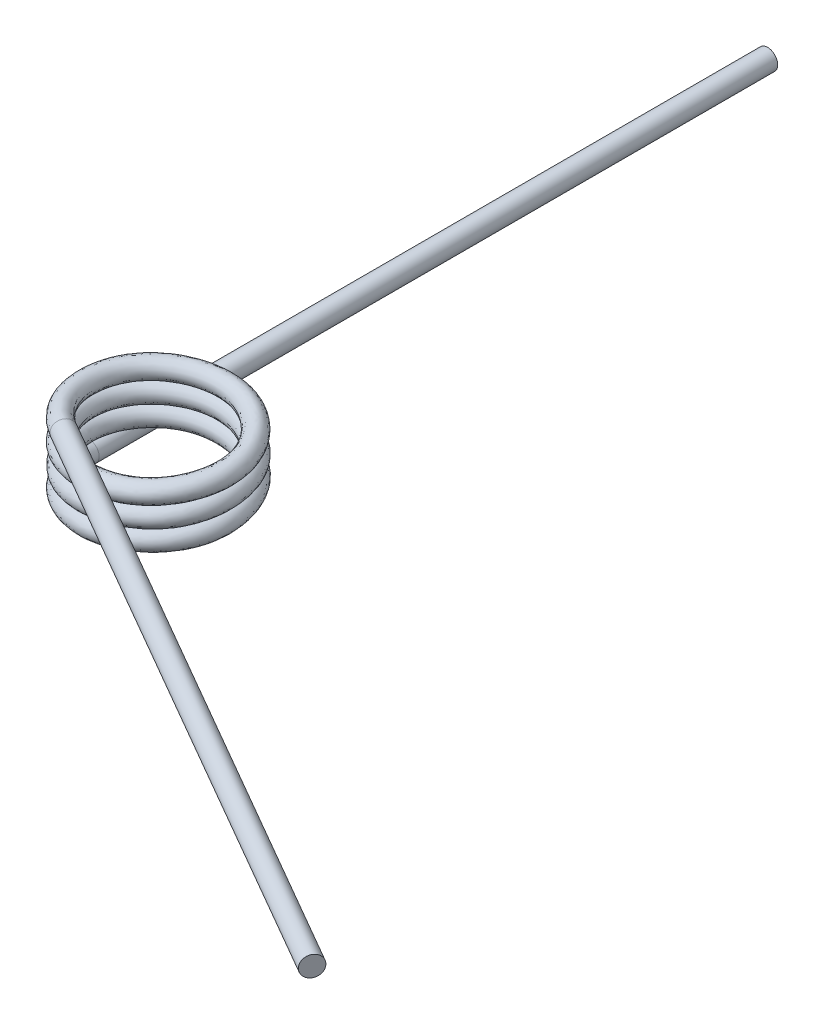
ISO-10303-21;
HEADER;
FILE_DESCRIPTION(('STEP AP214'),'2;1');
FILE_NAME('part.step','',(''),(''),'','','');
FILE_SCHEMA(('AUTOMOTIVE_DESIGN { 1 0 10303 214 1 1 1 1 }'));
ENDSEC;
DATA;
#1=APPLICATION_CONTEXT('core data for automotive mechanical design processes');
#2=APPLICATION_PROTOCOL_DEFINITION('international standard','automotive_design',2000,#1);
#3=PRODUCT_CONTEXT('',#1,'mechanical');
#4=PRODUCT('Part','Part','',(#3));
#5=PRODUCT_RELATED_PRODUCT_CATEGORY('part','',(#4));
#6=PRODUCT_DEFINITION_FORMATION('','',#4);
#7=PRODUCT_DEFINITION_CONTEXT('part definition',#1,'design');
#8=PRODUCT_DEFINITION('design','',#6,#7);
#9=PRODUCT_DEFINITION_SHAPE('','',#8);
#10=(LENGTH_UNIT() NAMED_UNIT(*) SI_UNIT(.MILLI.,.METRE.));
#11=(NAMED_UNIT(*) PLANE_ANGLE_UNIT() SI_UNIT($,.RADIAN.));
#12=(NAMED_UNIT(*) SI_UNIT($,.STERADIAN.) SOLID_ANGLE_UNIT());
#13=UNCERTAINTY_MEASURE_WITH_UNIT(LENGTH_MEASURE(1.E-05),#10,'distance_accuracy_value','');
#14=(GEOMETRIC_REPRESENTATION_CONTEXT(3) GLOBAL_UNCERTAINTY_ASSIGNED_CONTEXT((#13)) GLOBAL_UNIT_ASSIGNED_CONTEXT((#10,
#11,#12)) REPRESENTATION_CONTEXT('',''));
#15=CARTESIAN_POINT('',(0.,0.,0.));
#16=DIRECTION('',(0.,0.,1.));
#17=DIRECTION('',(1.,0.,0.));
#18=AXIS2_PLACEMENT_3D('',#15,#16,#17);
#19=CARTESIAN_POINT('',(40.751270189222,4.75,29.4167295593006));
#20=DIRECTION('',(-0.86602540378444,0.,-0.499999999999998));
#21=DIRECTION('',(0.499999999999998,0.,-0.86602540378444));
#22=AXIS2_PLACEMENT_3D('',#19,#20,#21);
#23=PLANE('',#22);
#24=CARTESIAN_POINT('',(40.751270189222,4.75,29.4167295593006));
#25=DIRECTION('',(0.86602540378444,0.,0.499999999999998));
#26=DIRECTION('',(0.499999999999998,0.,-0.86602540378444));
#27=AXIS2_PLACEMENT_3D('',#24,#25,#26);
#28=CIRCLE('',#27,0.745000000000001);
#29=CARTESIAN_POINT('',(41.123770189222,4.75,28.7715406334811));
#30=VERTEX_POINT('',#29);
#31=EDGE_CURVE('E52',#30,#30,#28,.T.);
#32=ORIENTED_EDGE('',*,*,#31,.T.);
#33=EDGE_LOOP('',(#32));
#34=FACE_BOUND('',#33,.T.);
#35=ADVANCED_FACE('F37',(#34),#23,.F.);
#36=CARTESIAN_POINT('',(-5.1,0.,-50.0000000000001));
#37=DIRECTION('',(0.,0.,-1.));
#38=DIRECTION('',(0.999999993495773,0.000114054609235299,0.));
#39=AXIS2_PLACEMENT_3D('',#36,#37,#38);
#40=PLANE('',#39);
#41=CARTESIAN_POINT('',(-5.1,0.,-50.0000000000001));
#42=DIRECTION('',(0.,0.,1.));
#43=DIRECTION('',(0.999999993495773,0.000114054609235299,0.));
#44=AXIS2_PLACEMENT_3D('',#41,#42,#43);
#45=CIRCLE('',#44,0.745000000000001);
#46=CARTESIAN_POINT('',(-4.35500000484565,8.49706838828999E-05,-50.0000000000001));
#47=VERTEX_POINT('',#46);
#48=EDGE_CURVE('E46',#47,#47,#45,.T.);
#49=ORIENTED_EDGE('',*,*,#48,.F.);
#50=EDGE_LOOP('',(#49));
#51=FACE_BOUND('',#50,.T.);
#52=ADVANCED_FACE('F121',(#51),#40,.T.);
#53=CARTESIAN_POINT('',(-2.54999999999986,4.75,4.41672955930072));
#54=DIRECTION('',(0.86602540378444,0.,0.499999999999998));
#55=DIRECTION('',(-0.499999999999998,0.,0.86602540378444));
#56=AXIS2_PLACEMENT_3D('',#53,#54,#55);
#57=CYLINDRICAL_SURFACE('',#56,0.745000000000001);
#58=ORIENTED_EDGE('',*,*,#31,.F.);
#59=EDGE_LOOP('',(#58));
#60=FACE_BOUND('',#59,.T.);
#61=CARTESIAN_POINT('',(-2.54999999999986,4.75,4.41672955930072));
#62=DIRECTION('',(0.865078141904125,0.0467590761205418,0.49945309809837));
#63=DIRECTION('',(0.499999999999971,0.,-0.866025403784455));
#64=AXIS2_PLACEMENT_3D('',#61,#62,#63);
#65=CIRCLE('',#64,0.745000000000001);
#66=CARTESIAN_POINT('',(-2.17749999999988,4.75,3.77154063348131));
#67=VERTEX_POINT('',#66);
#68=EDGE_CURVE('E40',#67,#67,#65,.T.);
#69=ORIENTED_EDGE('',*,*,#68,.T.);
#70=EDGE_LOOP('',(#69));
#71=FACE_BOUND('',#70,.T.);
#72=ADVANCED_FACE('F87',(#60,#71),#57,.T.);
#73=CARTESIAN_POINT('',(-4.35500000484565,8.487774262253E-05,-3.97315072508952E-06));
#74=CARTESIAN_POINT('',(-4.35500049170764,0.0318251134394401,0.580614354438627));
#75=CARTESIAN_POINT('',(-4.2364972186672,0.0637293674077387,1.15898934681182));
#76=CARTESIAN_POINT('',(-3.34382063298787,0.189542885596853,3.28676576476936));
#77=CARTESIAN_POINT('',(-1.64198350085726,0.285312357410858,4.39030935080475));
#78=CARTESIAN_POINT('',(1.82038378486212,0.474574749287439,4.31786427379777));
#79=CARTESIAN_POINT('',(3.47975661831278,0.570680960794775,3.13679904669445));
#80=CARTESIAN_POINT('',(4.68394249037422,0.759399147764391,-0.100663864271291));
#81=CARTESIAN_POINT('',(4.19578314369764,0.855808187502534,-2.08224169545151));
#82=CARTESIAN_POINT('',(1.63240436819268,1.04427251357315,-4.39049577210397));
#83=CARTESIAN_POINT('',(-0.39309143740907,1.14090778587528,-4.66687505816701));
#84=CARTESIAN_POINT('',(-3.28620030908023,1.31737576799749,-3.23081301513331));
#85=CARTESIAN_POINT('',(-4.24568962950313,1.40117141018875,-1.79832159252394));
#86=CARTESIAN_POINT('',(-4.46414136401961,1.58364356683938,1.51850371389823));
#87=CARTESIAN_POINT('',(-3.33398435376845,1.6823165192278,3.33163819513206));
#88=CARTESIAN_POINT('',(0.00172474382794839,1.88037268477115,4.71531052251248));
#89=CARTESIAN_POINT('',(2.08468449365833,1.97945582915486,4.22659895090588));
#90=CARTESIAN_POINT('',(4.46420956669407,2.17696977865208,1.51568252557284));
#91=CARTESIAN_POINT('',(4.67193967777459,2.27665500806623,-0.617961506523748));
#92=CARTESIAN_POINT('',(2.90720385488669,2.46948952572873,-3.67457675765263));
#93=CARTESIAN_POINT('',(1.07004084215955,2.56581083547791,-4.56023571167163));
#94=CARTESIAN_POINT('',(-2.34230030935838,2.75426742698828,-4.05634457903697));
#95=CARTESIAN_POINT('',(-3.8465986247731,2.85093068165208,-2.67149936492073));
#96=CARTESIAN_POINT('',(-4.63326245470203,3.03915174132399,0.682515674605258));
#97=CARTESIAN_POINT('',(-3.89952833681419,3.13595758715663,2.59332510243099));
#98=CARTESIAN_POINT('',(-1.07137739662917,3.32412813591685,4.55889107357602));
#99=CARTESIAN_POINT('',(0.974999867530022,3.42091086631926,4.5808468289116));
#100=CARTESIAN_POINT('',(3.84508417751786,3.60917709184034,2.6738681772122));
#101=CARTESIAN_POINT('',(4.61848238140257,3.70581236414485,0.781548440301908));
#102=CARTESIAN_POINT('',(3.90116810590134,3.8942766902123,-2.59253037609788));
#103=CARTESIAN_POINT('',(2.42915237049425,3.99068572995283,-4.00607907497452));
#104=CARTESIAN_POINT('',(-0.976665177286501,4.17940391692034,-4.5819580079773));
#105=CARTESIAN_POINT('',(-2.82918487864418,4.27551012841045,-3.73543333767719));
#106=CARTESIAN_POINT('',(-4.62311044298602,4.46477252033694,-0.773159450931185));
#107=CARTESIAN_POINT('',(-4.51833416186233,4.56054199214691,1.25244664889552));
#108=CARTESIAN_POINT('',(-3.12196563467448,4.68635551025706,3.08941668344599));
#109=CARTESIAN_POINT('',(-2.68033020664833,4.71825976418418,3.48123144049209));
#110=CARTESIAN_POINT('',(-2.17749999999988,4.75,3.77154063348131));
#111=CARTESIAN_POINT('',(-4.3550444953917,0.389739290851539,-0.0182438043106817));
#112=CARTESIAN_POINT('',(-4.35743067730607,0.42147901766897,0.562370637805144));
#113=CARTESIAN_POINT('',(-4.24143373838931,0.453383421193437,1.14127095934273));
#114=CARTESIAN_POINT('',(-3.35732175797539,0.57919731863556,3.2726535447019));
#115=CARTESIAN_POINT('',(-1.66037831683773,0.6749667534224,4.38361648445679));
#116=CARTESIAN_POINT('',(1.80230383103092,0.864228999829954,4.32536030468612));
#117=CARTESIAN_POINT('',(3.46679615785935,0.960335234594922,3.15145140882974));
#118=CARTESIAN_POINT('',(4.68422639277815,1.14905345994255,-0.0811043425474707));
#119=CARTESIAN_POINT('',(4.20464174518433,1.24546246580036,-2.06480433178066));
#120=CARTESIAN_POINT('',(1.65068884393576,1.43392682339603,-4.38355285397389));
#121=CARTESIAN_POINT('',(-0.373620759638226,1.53056206393851,-4.668699178064));
#122=CARTESIAN_POINT('',(-3.27261714850838,1.70703007601714,-3.24446049595396));
#123=CARTESIAN_POINT('',(-4.23812742949449,1.79082613925565,-1.81611002308571));
#124=CARTESIAN_POINT('',(-4.47060846940009,1.97329766548903,1.49980823636565));
#125=CARTESIAN_POINT('',(-3.34795401277138,2.07197143910668,3.3176853404266));
#126=CARTESIAN_POINT('',(-0.0180403796259266,2.27002653825817,4.71537739474776));
#127=CARTESIAN_POINT('',(2.06704907975817,2.36911060368498,4.23540387821955));
#128=CARTESIAN_POINT('',(4.45784688676837,2.56662365281875,1.53435744288643));
#129=CARTESIAN_POINT('',(4.67470740055399,2.66630928507945,-0.598484136218733));
#130=CARTESIAN_POINT('',(2.92246185338006,2.85914383611992,-3.66233179746611));
#131=CARTESIAN_POINT('',(1.08912348397193,2.95546511320404,-4.55594663461274));
#132=CARTESIAN_POINT('',(-2.32529594414166,3.14392173734746,-4.06600699417008));
#133=CARTESIAN_POINT('',(-3.83559468256181,3.24058495935131,-2.6876651041417));
#134=CARTESIAN_POINT('',(-4.63597819024973,3.42880605171079,0.663150434844749));
#135=CARTESIAN_POINT('',(-3.91050923385793,3.52561186475564,2.57714451171854));
#136=CARTESIAN_POINT('',(-1.09038141670151,3.71378244640444,4.55428586188423));
#137=CARTESIAN_POINT('',(0.955911186183937,3.81056514375629,4.58509727078419));
#138=CARTESIAN_POINT('',(3.83380861712062,3.99883140249007,2.68984538124462));
#139=CARTESIAN_POINT('',(4.61540012711368,4.09546664134996,0.800862976099099));
#140=CARTESIAN_POINT('',(3.91187980144262,4.28393100113013,-2.57616667756522));
#141=CARTESIAN_POINT('',(2.4459745527016,4.38034000938931,-3.99609432698256));
#142=CARTESIAN_POINT('',(-0.957505881448252,4.56905822341989,-4.58590277047893));
#143=CARTESIAN_POINT('',(-2.81368190913212,4.66516434884079,-3.74738141756176));
#144=CARTESIAN_POINT('',(-4.61975659764122,4.85442694762752,-0.792443928112072));
#145=CARTESIAN_POINT('',(-4.52385147960471,4.95019637584698,1.23371077991619));
#146=CARTESIAN_POINT('',(-3.13487375476307,5.07600957814911,3.07631401487017));
#147=CARTESIAN_POINT('',(-2.69494216833974,5.10791365766652,3.4700404570818));
#148=CARTESIAN_POINT('',(-2.19329615724789,5.13965441564331,3.76242071784201));
#149=CARTESIAN_POINT('',(-4.71000388540033,0.744229553208378,-0.0348375918201096));
#150=CARTESIAN_POINT('',(-4.71455967713096,0.77607512328392,0.594473174599712));
#151=CARTESIAN_POINT('',(-4.59163304717953,0.807781040852221,1.21853993434331));
#152=CARTESIAN_POINT('',(-3.64119863484889,0.934101416257114,3.52986305417836));
#153=CARTESIAN_POINT('',(-1.81309820878181,1.02922768950157,4.73536929162816));
#154=CARTESIAN_POINT('',(1.93640113695547,1.21897955229377,4.68402671420631));
#155=CARTESIAN_POINT('',(3.73781945984736,1.31458472797592,3.42250394914565));
#156=CARTESIAN_POINT('',(5.06698587987493,1.50382504584466,-0.0735951352792703));
#157=CARTESIAN_POINT('',(4.5562930567729,1.59971260049663,-2.21715158775408));
#158=CARTESIAN_POINT('',(1.7987114423202,1.78869741487151,-4.73653229136875));
#159=CARTESIAN_POINT('',(-0.385957075424886,1.88481246259124,-5.05167982705533));
#160=CARTESIAN_POINT('',(-3.52981044259893,2.06176782940682,-3.51931634967948));
#161=CARTESIAN_POINT('',(-4.57732636628947,2.14541557266747,-1.97819271011646));
#162=CARTESIAN_POINT('',(-4.84025928792202,2.32768000475795,1.60547371382181));
#163=CARTESIAN_POINT('',(-3.63231693014202,2.42649103323058,3.57655020059567));
#164=CARTESIAN_POINT('',(-0.0363415266428418,2.62447815546436,5.09954733877955));
#165=CARTESIAN_POINT('',(2.22024333216708,2.7235041443518,4.58862591389111));
#166=CARTESIAN_POINT('',(4.81629870353897,2.92120768729321,1.67439859418513));
#167=CARTESIAN_POINT('',(5.05913211866886,3.02054793186292,-0.6291196301077));
#168=CARTESIAN_POINT('',(3.17215984484991,3.21391505086447,-3.95258351230329));
#169=CARTESIAN_POINT('',(1.19588447680311,3.30971523753973,-4.92401349945385));
#170=CARTESIAN_POINT('',(-2.50291005334711,3.49869233866248,-4.40505321815332));
#171=CARTESIAN_POINT('',(-4.1385631695663,3.59483541492487,-2.92224861440896));
#172=CARTESIAN_POINT('',(-5.01655131330704,3.78357633327837,0.70331189020526));
#173=CARTESIAN_POINT('',(-4.24011786904683,3.87986239603685,2.77250724674309));
#174=CARTESIAN_POINT('',(-1.19316630797728,4.06855266137855,4.92289554942145));
#175=CARTESIAN_POINT('',(1.01615802759908,4.1648155503018,4.96351542009702));
#176=CARTESIAN_POINT('',(4.13875830423928,4.35360174832622,2.92106691393977));
#177=CARTESIAN_POINT('',(4.98944909100556,4.4497167928321,0.884298869037772));
#178=CARTESIAN_POINT('',(4.23909700445234,4.63870161138185,-2.77473204574294));
#179=CARTESIAN_POINT('',(2.66143819700871,4.73458917061701,-4.31312278163305));
#180=CARTESIAN_POINT('',(-1.02186074915307,4.92382946687584,-4.96327742409076));
#181=CARTESIAN_POINT('',(-3.0290118780056,5.01943443374947,-4.06455226657031));
#182=CARTESIAN_POINT('',(-4.99459760573388,5.20918696946724,-0.871144372217623));
#183=CARTESIAN_POINT('',(-4.89853712098518,5.30431323017519,1.3168471208478));
#184=CARTESIAN_POINT('',(-3.40034917397344,5.43063227806898,3.31709039507635));
#185=CARTESIAN_POINT('',(-2.92787544230319,5.4623374883054,3.74287570171008));
#186=CARTESIAN_POINT('',(-2.38512789418403,5.49418511616661,4.06149167185719));
#187=CARTESIAN_POINT('',(-5.49016605596744,0.744140669444153,-0.0348334311464568));
#188=CARTESIAN_POINT('',(-5.49472007090127,0.776222162639324,0.701527246464447));
#189=CARTESIAN_POINT('',(-5.35154782483945,0.807489233928933,1.4238248903084));
#190=CARTESIAN_POINT('',(-4.23819807729256,0.934922161312581,4.123470525828));
#191=CARTESIAN_POINT('',(-2.11200858906273,1.02863474820576,5.52195765150577));
#192=CARTESIAN_POINT('',(2.26732596795203,1.21946314828308,5.45743435944999));
#193=CARTESIAN_POINT('',(4.35948809007297,1.31396687842289,3.98901120418614));
#194=CARTESIAN_POINT('',(5.9077777883917,1.5043547530516,-0.0962078746551791));
#195=CARTESIAN_POINT('',(5.31155537925925,1.5990961516578,-2.58690722051507));
#196=CARTESIAN_POINT('',(2.08751718471482,1.78922494089049,-5.52631706227848));
#197=CARTESIAN_POINT('',(-0.4520154051237,1.88419659443432,-5.8898774458445));
#198=CARTESIAN_POINT('',(-4.12232415151877,2.06222317625745,-4.09619359038436));
#199=CARTESIAN_POINT('',(-5.33805820346156,2.14554404904878,-2.29889661458386));
#200=CARTESIAN_POINT('',(-5.63987007520574,2.32735451963978,1.87513239529126));
#201=CARTESIAN_POINT('',(-4.22944769063462,2.42646561131394,4.17347763743608));
#202=CARTESIAN_POINT('',(-0.0370398000383563,2.62430544341662,5.94387369228624));
#203=CARTESIAN_POINT('',(2.59225688388096,2.72320192973785,5.34744825930949));
#204=CARTESIAN_POINT('',(5.61695206507592,2.92132600584175,1.94487909922212));
#205=CARTESIAN_POINT('',(5.89861680067396,3.01990623352033,-0.735415537240408));
#206=CARTESIAN_POINT('',(3.69051549601561,3.21444394578971,-4.61508792431861));
#207=CARTESIAN_POINT('',(1.39239501794561,3.3090987670718,-5.74165489646761));
#208=CARTESIAN_POINT('',(-2.92733982111516,3.49921988523607,-5.1310001405946));
#209=CARTESIAN_POINT('',(-4.8265388169353,3.59421967261138,-3.40556500785633));
#210=CARTESIAN_POINT('',(-5.84767361685504,3.78410317695367,0.830322952514589));
#211=CARTESIAN_POINT('',(-4.94268266711585,3.87924682034304,3.2343034658016));
#212=CARTESIAN_POINT('',(-1.38109405669894,4.06907935846729,5.7423624170537));
#213=CARTESIAN_POINT('',(1.18676650414381,4.16419970074284,5.78683137265326));
#214=CARTESIAN_POINT('',(4.83163214722849,4.35412873274636,3.39737027352276));
#215=CARTESIAN_POINT('',(5.81782634580706,4.44910038307283,1.02907373994264));
#216=CARTESIAN_POINT('',(4.93694349796565,4.6392291764874,-3.24393432292377));
#217=CARTESIAN_POINT('',(3.10141352357758,4.7339705796753,-5.02996584629591));
#218=CARTESIAN_POINT('',(-1.20164047990981,4.92435843269058,-5.78491098362635));
#219=CARTESIAN_POINT('',(-3.53334367041953,5.0188619540395,-4.73784267848622));
#220=CARTESIAN_POINT('',(-5.82525906829581,5.20969102699668,-1.00557017128968));
#221=CARTESIAN_POINT('',(-5.71111473926703,5.303403601353,1.53706434348533));
#222=CARTESIAN_POINT('',(-3.95808560885006,5.43083520130997,3.87255641170948));
#223=CARTESIAN_POINT('',(-3.4106709091389,5.46210148617989,4.3649887010523));
#224=CARTESIAN_POINT('',(-2.77520898200474,5.49418511616661,4.73713193503445));
#225=CARTESIAN_POINT('',(-5.8450444857004,0.389569535366292,-0.0182358580093425));
#226=CARTESIAN_POINT('',(-5.84742837549561,0.421759613451153,0.766831884059942));
#227=CARTESIAN_POINT('',(-5.69276405670763,0.452826111021651,1.53333634515696));
#228=CARTESIAN_POINT('',(-4.49750670543015,0.580764826228365,4.40636030512396));
#229=CARTESIAN_POINT('',(-2.23125509158828,0.673834318963919,5.88588959229118));
#230=CARTESIAN_POINT('',(2.43432370276272,0.865152600136041,5.80246010187565));
#231=CARTESIAN_POINT('',(4.65409578344832,0.959155228871182,4.233400568061));
#232=CARTESIAN_POINT('',(6.29002065300142,1.15006512618537,-0.124291493515644));
#233=CARTESIAN_POINT('',(5.6470865286489,1.24428513524017,-2.77098557207701));
#234=CARTESIAN_POINT('',(2.20226718187352,1.43493432388023,-5.89193065718513));
#235=CARTESIAN_POINT('',(-0.499782876061817,1.52938584239796,-6.26953870987521));
#236=CARTESIAN_POINT('',(-4.40423497602097,1.70789972444492,-4.34621486894448));
#237=CARTESIAN_POINT('',(-5.6910182165343,1.79107151106951,-2.42860936306261));
#238=CARTESIAN_POINT('',(-5.99775258154973,1.97267603470351,2.0148183816061));
#239=CARTESIAN_POINT('',(-4.48838975921416,2.07192288682483,4.45773276731291));
#240=CARTESIAN_POINT('',(-0.0193739835888632,2.2696966825421,6.32792194766549));
#241=CARTESIAN_POINT('',(2.77754262758543,2.36853341628821,5.6846478046379));
#242=CARTESIAN_POINT('',(5.98698216907133,2.56684962460162,2.05093715553066));
#243=CARTESIAN_POINT('',(6.27800504205815,2.66508373152366,-0.801494364822466));
#244=CARTESIAN_POINT('',(3.91244822332047,2.86015395101819,-4.92762202137869));
#245=CARTESIAN_POINT('',(1.46443097187257,2.95428774133513,-6.11752667474782));
#246=CARTESIAN_POINT('',(-3.13589709055998,3.14492927708825,-5.45246348771717));
#247=CARTESIAN_POINT('',(-5.14953138263392,3.23940897815793,-3.610731421262));
#248=CARTESIAN_POINT('',(-6.22330486532812,3.42981224901175,0.905723695557673));
#249=CARTESIAN_POINT('',(-5.25230915932276,3.52443620177992,3.45911032326988));
#250=CARTESIAN_POINT('',(-1.44929697853539,3.71478836374818,6.11935229410909));
#251=CARTESIAN_POINT('',(1.28174937471745,3.80938895773608,6.15751491368511));
#252=CARTESIAN_POINT('',(5.15710018170253,3.99983786859694,3.59951779031942));
#253=CARTESIAN_POINT('',(6.19748414527064,4.09428938542942,1.07736261217503));
#254=CARTESIAN_POINT('',(5.24466842898815,4.28493857626099,-3.47227701824078));
#255=CARTESIAN_POINT('',(3.28626552944709,4.37915858771589,-5.36516373293039));
#256=CARTESIAN_POINT('',(-1.30085987526286,4.57006847370953,-6.15510727940128));
#257=CARTESIAN_POINT('',(-3.77688468179441,4.66407099313209,-5.03327138385749));
#258=CARTESIAN_POINT('',(-6.20620313126387,4.85538962659724,-1.04917829294667));
#259=CARTESIAN_POINT('',(-6.07576041474808,4.94845911276462,1.6542946943457));
#260=CARTESIAN_POINT('',(-4.20007188140029,5.07639713299196,4.13717596207462));
#261=CARTESIAN_POINT('',(-3.61701046162685,5.10746321600574,4.65818931325825));
#262=CARTESIAN_POINT('',(-2.93829615724784,5.13965441564331,5.05279856948085));
#263=CARTESIAN_POINT('',(-5.84495550460831,-0.38973929085154,0.0182438043105707));
#264=CARTESIAN_POINT('',(-5.84257049691082,-0.357548104666178,0.80332615914921));
#265=CARTESIAN_POINT('',(-5.68289101726341,-0.326481996549454,1.56877312009514));
#266=CARTESIAN_POINT('',(-4.47050445545511,-0.19854403984993,4.43458474525888));
#267=CARTESIAN_POINT('',(-2.19446545962736,-0.105474473058284,5.8992753249871));
#268=CARTESIAN_POINT('',(2.47048361042511,0.0858440990501328,5.78746804009895));
#269=CARTESIAN_POINT('',(4.6800167043587,0.179846681270887,4.20409584379043));
#270=CARTESIAN_POINT('',(6.28945284819005,0.370756501829064,-0.163410536963286));
#271=CARTESIAN_POINT('',(5.62936932567553,0.464976578644514,-2.80586029941169));
#272=CARTESIAN_POINT('',(2.16569823038737,0.655625704234466,-5.9058164934523));
#273=CARTESIAN_POINT('',(-0.538724231610519,0.750077286272374,-6.26589047008124));
#274=CARTESIAN_POINT('',(-4.43140129715853,0.928591108404852,-4.31891990730318));
#275=CARTESIAN_POINT('',(-5.70614261655157,1.01176205293648,-2.39303250193908));
#276=CARTESIAN_POINT('',(-5.98481837078877,1.1933678374033,2.05220933667127));
#277=CARTESIAN_POINT('',(-4.46045044120831,1.29261304706799,4.48563847672382));
#278=CARTESIAN_POINT('',(0.020156263318887,1.49038897556715,6.32778820319493));
#279=CARTESIAN_POINT('',(2.81281345538575,1.5892238672289,5.66703795000322));
#280=CARTESIAN_POINT('',(5.99970752892274,1.78754187626736,2.01358732091082));
#281=CARTESIAN_POINT('',(6.27246959649935,1.88577517749629,-0.840449105432491));
#282=CARTESIAN_POINT('',(3.88193222633373,2.08084533023669,-4.95211194175172));
#283=CARTESIAN_POINT('',(1.42626568824782,2.17497918588375,-6.12610482886558));
#284=CARTESIAN_POINT('',(-3.16990582099342,2.36562065636901,-5.43313865745095));
#285=CARTESIAN_POINT('',(-5.17153926705475,2.46010042275947,-3.57839994282707));
#286=CARTESIAN_POINT('',(-6.21787339423448,2.65050362823817,0.944454175085709));
#287=CARTESIAN_POINT('',(-5.23034736523527,2.74512764658189,3.49147150469477));
#288=CARTESIAN_POINT('',(-1.4112889383907,2.93547974277301,6.12856271749266));
#289=CARTESIAN_POINT('',(1.31992673739559,3.03008040286116,6.14901402993992));
#290=CARTESIAN_POINT('',(5.17965130251104,3.22052924729835,3.56756338225459));
#291=CARTESIAN_POINT('',(6.20364865384843,3.31498083101919,1.03873354056662));
#292=CARTESIAN_POINT('',(5.22324503790561,3.50562995442534,-3.50500441529207));
#293=CARTESIAN_POINT('',(3.25262116502539,3.5998500288438,-5.3851332289143));
#294=CARTESIAN_POINT('',(-1.33917846693234,3.79075986070957,-6.14721775439802));
#295=CARTESIAN_POINT('',(-3.80789062082204,3.88476255227053,-5.00937522408835));
#296=CARTESIAN_POINT('',(-6.21291082194996,4.07608077201696,-1.0106093385849));
#297=CARTESIAN_POINT('',(-6.06472577926333,4.16915034536447,1.69176643230437));
#298=CARTESIAN_POINT('',(-4.17425564122312,4.29708899720787,4.16338129922628));
#299=CARTESIAN_POINT('',(-3.58777936676489,4.3281555199646,4.68057254225263));
#300=CARTESIAN_POINT('',(-2.90670384275184,4.36034558435668,5.07103840075944));
#301=CARTESIAN_POINT('',(-5.48999611459968,-0.744229553208378,0.0348375918199986));
#302=CARTESIAN_POINT('',(-5.48544131160056,-0.712145948989051,0.771223722031678));
#303=CARTESIAN_POINT('',(-5.33269170847086,-0.68087961620853,1.49150414509222));
#304=CARTESIAN_POINT('',(-4.18662757858866,-0.553448137470603,4.17737523578949));
#305=CARTESIAN_POINT('',(-2.04174556768328,-0.459735409139213,5.54752251781574));
#306=CARTESIAN_POINT('',(2.33638630450057,-0.268906453411928,5.42880163057876));
#307=CARTESIAN_POINT('',(4.4089934023742,-0.174402812109237,3.93304330348857));
#308=CARTESIAN_POINT('',(5.90669336108976,0.0159849159260747,-0.17091974424551));
#309=CARTESIAN_POINT('',(5.27771801408696,0.110726443945618,-2.65351304344528));
#310=CARTESIAN_POINT('',(2.01767563200292,0.300855112761617,-5.55283705605042));
#311=CARTESIAN_POINT('',(-0.526387915816845,0.395826887619652,-5.88290982110042));
#312=CARTESIAN_POINT('',(-4.17420800307411,0.573853355015173,-4.04406405356846));
#313=CARTESIAN_POINT('',(-5.36694367975351,0.657172619523881,-2.23094981490215));
#314=CARTESIAN_POINT('',(-5.61516755227052,0.83898549813529,1.94654385920778));
#315=CARTESIAN_POINT('',(-4.17608752383032,0.938093452944996,4.22677361655107));
#316=CARTESIAN_POINT('',(0.0384574103284596,1.13593735836003,5.94361825916681));
#317=CARTESIAN_POINT('',(2.65961920296949,1.23483032656116,5.31381591436103));
#318=CARTESIAN_POINT('',(5.64125571215947,1.43295784179382,1.87354616958275));
#319=CARTESIAN_POINT('',(5.88804487838081,1.53153653071465,-0.80981361154353));
#320=CARTESIAN_POINT('',(3.63223423486741,1.72607411549038,-4.66186022691456));
#321=CARTESIAN_POINT('',(1.31950469542367,1.82072906154631,-5.75803796403151));
#322=CARTESIAN_POINT('',(-2.992291711795,2.01085005505575,-5.09409243346068));
#323=CARTESIAN_POINT('',(-4.8685707800485,2.10584996718679,-3.34381643255279));
#324=CARTESIAN_POINT('',(-5.83730027117892,2.2957333466697,0.90429271971818));
#325=CARTESIAN_POINT('',(-4.90073873005339,2.39087711530025,3.29610876967022));
#326=CARTESIAN_POINT('',(-1.30850404710794,2.58070952779933,5.75995302995545));
#327=CARTESIAN_POINT('',(1.25967989598746,2.67582999631783,5.7705958806271));
#328=CARTESIAN_POINT('',(4.87470161538537,2.86575890146001,3.33634184955945));
#329=CARTESIAN_POINT('',(5.82959968994953,2.96073067953705,0.955297647627942));
#330=CARTESIAN_POINT('',(4.8960278349029,3.15085934417361,-3.30643904711435));
#331=CARTESIAN_POINT('',(3.03715752071828,3.24560086761611,-5.0681047742603));
#332=CARTESIAN_POINT('',(-1.27482359922751,3.43598861725362,-5.7698431007897));
#333=CARTESIAN_POINT('',(-3.59256065195207,3.53049246736361,-4.69220437509385));
#334=CARTESIAN_POINT('',(-5.83806981385378,3.72132075017549,-0.931908894465275));
#335=CARTESIAN_POINT('',(-5.69004013788284,3.81503349103538,1.60863009135865));
#336=CARTESIAN_POINT('',(-3.90878022201273,3.94246629728828,3.92260491902475));
#337=CARTESIAN_POINT('',(-3.35484620430191,3.97373341652684,4.40773706641771));
#338=CARTESIAN_POINT('',(-2.7148721058157,4.00581488383338,4.77196744674426));
#339=CARTESIAN_POINT('',(-4.70983394403257,-0.744140669444153,0.0348334311463458));
#340=CARTESIAN_POINT('',(-4.7052784658313,-0.712293067203743,0.664162919761394));
#341=CARTESIAN_POINT('',(-4.57277693081094,-0.680587809285532,1.28621918912712));
#342=CARTESIAN_POINT('',(-3.58962813614499,-0.554268882525188,3.58376776413984));
#343=CARTESIAN_POINT('',(-1.74283518740939,-0.459142467841647,4.76093415793813));
#344=CARTESIAN_POINT('',(2.00546147351102,-0.269390049402995,4.65539398533509));
#345=CARTESIAN_POINT('',(3.78732477215209,-0.173784962556207,3.36653604844808));
#346=CARTESIAN_POINT('',(5.06590145256948,0.0154552087191372,-0.148307004869602));
#347=CARTESIAN_POINT('',(4.5224556916006,0.111342892785323,-2.28375741068429));
#348=CARTESIAN_POINT('',(1.7288698896083,0.300327586741759,-4.7630522851407));
#349=CARTESIAN_POINT('',(-0.460329586118031,0.396442755777445,-5.04471220231126));
#350=CARTESIAN_POINT('',(-3.58169429415428,0.573398008163779,-3.46718681286358));
#351=CARTESIAN_POINT('',(-4.60621184258142,0.657044143142578,-1.91024591043475));
#352=CARTESIAN_POINT('',(-4.8155567649868,0.839310983253462,1.67688517773832));
#353=CARTESIAN_POINT('',(-3.57895676333773,0.938118874859801,3.62984617971067));
#354=CARTESIAN_POINT('',(0.0391556837239736,1.13611007040961,5.09929190566012));
#355=CARTESIAN_POINT('',(2.28760565125561,1.23513254117419,4.55499356894265));
#356=CARTESIAN_POINT('',(4.84060235062252,1.4328395232462,1.60306566454577));
#357=CARTESIAN_POINT('',(5.0485601963757,1.53217822905633,-0.703517704418157));
#358=CARTESIAN_POINT('',(3.11387858370171,1.72554522056602,-3.99935581489218));
#359=CARTESIAN_POINT('',(1.12299415428117,1.821345532016,-4.94039656701775));
#360=CARTESIAN_POINT('',(-2.56786194402695,2.0103225084804,-4.3681455110194));
#361=CARTESIAN_POINT('',(-4.18059513267951,2.1064657094994,-2.86050003910541));
#362=CARTESIAN_POINT('',(-5.00617796763092,2.29520650299528,0.777281657408856));
#363=CARTESIAN_POINT('',(-4.19817393198439,2.39149269099406,2.83431255061872));
#364=CARTESIAN_POINT('',(-1.12057629838628,2.58018283071059,4.94048616231618));
#365=CARTESIAN_POINT('',(1.0890714194287,2.67644584587767,4.94727992807086));
#366=CARTESIAN_POINT('',(4.18182777241018,2.86523191703899,2.86003848997646));
#367=CARTESIAN_POINT('',(5.00122243514804,2.96134708929457,0.810522776723064));
#368=CARTESIAN_POINT('',(4.19818134138958,3.15033177906981,-2.83723676993353));
#369=CARTESIAN_POINT('',(2.59718219414941,3.24621945855694,-4.35126170959744));
#370=CARTESIAN_POINT('',(-1.09504386847078,3.43545965143975,-4.9482095412541));
#371=CARTESIAN_POINT('',(-3.08822885953814,3.53106494707445,-4.01891396317794));
#372=CARTESIAN_POINT('',(-5.00740835129184,3.72081669264517,-0.797483095393215));
#373=CARTESIAN_POINT('',(-4.877462519601,3.81594311985845,1.38841286872113));
#374=CARTESIAN_POINT('',(-3.35104378713611,3.942263374047,3.36713890239162));
#375=CARTESIAN_POINT('',(-2.87205779215216,3.97396933923458,3.78562282543962));
#376=CARTESIAN_POINT('',(-2.32479101799499,4.00581488383338,4.096327183567));
#377=CARTESIAN_POINT('',(-4.35495551429961,-0.389569535366294,0.0182358580092315));
#378=CARTESIAN_POINT('',(-4.35257030610921,-0.35782879079009,0.59885807107211));
#379=CARTESIAN_POINT('',(-4.23156069894509,-0.32592468637796,1.17670773428091));
#380=CARTESIAN_POINT('',(-3.33031950800035,-0.200111547441854,3.30087798483682));
#381=CARTESIAN_POINT('',(-1.62358868487679,-0.104342038600683,4.39700221715271));
#382=CARTESIAN_POINT('',(1.83846373869332,0.0849204987449236,4.31036824290942));
#383=CARTESIAN_POINT('',(3.49271707876622,0.181026686994628,3.12214668455916));
#384=CARTESIAN_POINT('',(4.68365858797029,0.369744835586236,-0.120223385995112));
#385=CARTESIAN_POINT('',(4.18692454221095,0.466153909204704,-2.09967905912235));
#386=CARTESIAN_POINT('',(1.6141198924496,0.654618203750264,-4.39743869023405));
#387=CARTESIAN_POINT('',(-0.412562115179915,0.751253507812054,-4.66505093827003));
#388=CARTESIAN_POINT('',(-3.29978346965207,0.927721459977843,-3.21716553431266));
#389=CARTESIAN_POINT('',(-4.25325182951176,1.01151668112185,-1.78053316196218));
#390=CARTESIAN_POINT('',(-4.45767425863913,1.19398946818974,1.53719919143081));
#391=CARTESIAN_POINT('',(-3.32001469476553,1.29266159934892,3.34559104983751));
#392=CARTESIAN_POINT('',(0.0214898672818234,1.49071883128414,4.7152436502772));
#393=CARTESIAN_POINT('',(2.10231990755849,1.58980105462474,4.21779402359221));
#394=CARTESIAN_POINT('',(4.47057224661978,1.78731590448541,1.49700760825925));
#395=CARTESIAN_POINT('',(4.66917195499518,1.887000731053,-0.637438876828764));
#396=CARTESIAN_POINT('',(2.89194585639332,2.07983521533754,-3.68682171783915));
#397=CARTESIAN_POINT('',(1.05095820034717,2.17615655775178,-4.56452478873051));
#398=CARTESIAN_POINT('',(-2.3593046745751,2.36461311662911,-4.04668216390386));
#399=CARTESIAN_POINT('',(-3.8576025669844,2.46127640395285,-2.65533362569975));
#400=CARTESIAN_POINT('',(-4.63054671915433,2.6494974309372,0.701880914365766));
#401=CARTESIAN_POINT('',(-3.88854743977044,2.74630330955762,2.60950569314343));
#402=CARTESIAN_POINT('',(-1.05237337655682,2.93447382542926,4.56349628526781));
#403=CARTESIAN_POINT('',(0.994088548876108,3.03125658888224,4.576596387039));
#404=CARTESIAN_POINT('',(3.85635973791511,3.2195227811906,2.65789097317979));
#405=CARTESIAN_POINT('',(4.62156463569147,3.31615808693973,0.762233904504716));
#406=CARTESIAN_POINT('',(3.89045641036007,3.50462237929447,-2.60889407463055));
#407=CARTESIAN_POINT('',(2.41233018828691,3.60103145051635,-4.01606382296648));
#408=CARTESIAN_POINT('',(-0.99582447312475,3.78974961042081,-4.57801324547567));
#409=CARTESIAN_POINT('',(-2.84468784815624,3.8858559079801,-3.72348525779262));
#410=CARTESIAN_POINT('',(-4.62646428833082,4.07511809304636,-0.753874973750298));
#411=CARTESIAN_POINT('',(-4.51281684411996,4.17088760844683,1.27118251787484));
#412=CARTESIAN_POINT('',(-3.10905751458589,4.29670144236501,3.10251935202182));
#413=CARTESIAN_POINT('',(-2.66571824495692,4.32860587070184,3.49242242390237));
#414=CARTESIAN_POINT('',(-2.16170384275188,4.36034558435668,3.7806605491206));
#415=CARTESIAN_POINT('',(-4.35500000484565,8.487774262253E-05,-3.97315072508952E-06));
#416=CARTESIAN_POINT('',(-4.35500049170764,0.0318251134394401,0.580614354438627));
#417=CARTESIAN_POINT('',(-4.2364972186672,0.0637293674077387,1.15898934681182));
#418=CARTESIAN_POINT('',(-3.34382063298787,0.189542885596853,3.28676576476936));
#419=CARTESIAN_POINT('',(-1.64198350085726,0.285312357410858,4.39030935080475));
#420=CARTESIAN_POINT('',(1.82038378486212,0.474574749287439,4.31786427379777));
#421=CARTESIAN_POINT('',(3.47975661831278,0.570680960794775,3.13679904669445));
#422=CARTESIAN_POINT('',(4.68394249037422,0.759399147764391,-0.100663864271291));
#423=CARTESIAN_POINT('',(4.19578314369764,0.855808187502534,-2.08224169545151));
#424=CARTESIAN_POINT('',(1.63240436819268,1.04427251357315,-4.39049577210397));
#425=CARTESIAN_POINT('',(-0.39309143740907,1.14090778587528,-4.66687505816701));
#426=CARTESIAN_POINT('',(-3.28620030908023,1.31737576799749,-3.23081301513331));
#427=CARTESIAN_POINT('',(-4.24568962950313,1.40117141018875,-1.79832159252394));
#428=CARTESIAN_POINT('',(-4.46414136401961,1.58364356683938,1.51850371389823));
#429=CARTESIAN_POINT('',(-3.33398435376845,1.6823165192278,3.33163819513206));
#430=CARTESIAN_POINT('',(0.00172474382794839,1.88037268477115,4.71531052251248));
#431=CARTESIAN_POINT('',(2.08468449365833,1.97945582915486,4.22659895090588));
#432=CARTESIAN_POINT('',(4.46420956669407,2.17696977865208,1.51568252557284));
#433=CARTESIAN_POINT('',(4.67193967777459,2.27665500806623,-0.617961506523748));
#434=CARTESIAN_POINT('',(2.90720385488669,2.46948952572873,-3.67457675765263));
#435=CARTESIAN_POINT('',(1.07004084215955,2.56581083547791,-4.56023571167163));
#436=CARTESIAN_POINT('',(-2.34230030935838,2.75426742698828,-4.05634457903697));
#437=CARTESIAN_POINT('',(-3.8465986247731,2.85093068165208,-2.67149936492073));
#438=CARTESIAN_POINT('',(-4.63326245470203,3.03915174132399,0.682515674605258));
#439=CARTESIAN_POINT('',(-3.89952833681419,3.13595758715663,2.59332510243099));
#440=CARTESIAN_POINT('',(-1.07137739662917,3.32412813591685,4.55889107357602));
#441=CARTESIAN_POINT('',(0.974999867530022,3.42091086631926,4.5808468289116));
#442=CARTESIAN_POINT('',(3.84508417751786,3.60917709184034,2.6738681772122));
#443=CARTESIAN_POINT('',(4.61848238140257,3.70581236414485,0.781548440301908));
#444=CARTESIAN_POINT('',(3.90116810590134,3.8942766902123,-2.59253037609788));
#445=CARTESIAN_POINT('',(2.42915237049425,3.99068572995283,-4.00607907497452));
#446=CARTESIAN_POINT('',(-0.976665177286501,4.17940391692034,-4.5819580079773));
#447=CARTESIAN_POINT('',(-2.82918487864418,4.27551012841045,-3.73543333767719));
#448=CARTESIAN_POINT('',(-4.62311044298602,4.46477252033694,-0.773159450931185));
#449=CARTESIAN_POINT('',(-4.51833416186233,4.56054199214691,1.25244664889552));
#450=CARTESIAN_POINT('',(-3.12196563467448,4.68635551025706,3.08941668344599));
#451=CARTESIAN_POINT('',(-2.68033020664833,4.71825976418418,3.48123144049209));
#452=CARTESIAN_POINT('',(-2.17749999999988,4.75,3.77154063348131));
#453=B_SPLINE_SURFACE_WITH_KNOTS('',3,3,((#73,#74,#75,#76,#77,#78,#79,#80,#81,#82,#83,#84,#85,
#86,#87,#88,#89,#90,#91,#92,#93,#94,#95,#96,#97,#98,#99,#100,#101,#102,#103,#104,#105,#106,#107,
#108,#109,#110),(#111,#112,#113,#114,#115,#116,#117,#118,#119,#120,#121,#122,#123,#124,#125,
#126,#127,#128,#129,#130,#131,#132,#133,#134,#135,#136,#137,#138,#139,#140,#141,#142,#143,#144,
#145,#146,#147,#148),(#149,#150,#151,#152,#153,#154,#155,#156,#157,#158,#159,#160,#161,#162,
#163,#164,#165,#166,#167,#168,#169,#170,#171,#172,#173,#174,#175,#176,#177,#178,#179,#180,#181,
#182,#183,#184,#185,#186),(#187,#188,#189,#190,#191,#192,#193,#194,#195,#196,#197,#198,#199,
#200,#201,#202,#203,#204,#205,#206,#207,#208,#209,#210,#211,#212,#213,#214,#215,#216,#217,#218,
#219,#220,#221,#222,#223,#224),(#225,#226,#227,#228,#229,#230,#231,#232,#233,#234,#235,#236,
#237,#238,#239,#240,#241,#242,#243,#244,#245,#246,#247,#248,#249,#250,#251,#252,#253,#254,#255,
#256,#257,#258,#259,#260,#261,#262),(#263,#264,#265,#266,#267,#268,#269,#270,#271,#272,#273,
#274,#275,#276,#277,#278,#279,#280,#281,#282,#283,#284,#285,#286,#287,#288,#289,#290,#291,#292,
#293,#294,#295,#296,#297,#298,#299,#300),(#301,#302,#303,#304,#305,#306,#307,#308,#309,#310,
#311,#312,#313,#314,#315,#316,#317,#318,#319,#320,#321,#322,#323,#324,#325,#326,#327,#328,#329,
#330,#331,#332,#333,#334,#335,#336,#337,#338),(#339,#340,#341,#342,#343,#344,#345,#346,#347,
#348,#349,#350,#351,#352,#353,#354,#355,#356,#357,#358,#359,#360,#361,#362,#363,#364,#365,#366,
#367,#368,#369,#370,#371,#372,#373,#374,#375,#376),(#377,#378,#379,#380,#381,#382,#383,#384,
#385,#386,#387,#388,#389,#390,#391,#392,#393,#394,#395,#396,#397,#398,#399,#400,#401,#402,#403,
#404,#405,#406,#407,#408,#409,#410,#411,#412,#413,#414),(#415,#416,#417,#418,#419,#420,#421,
#422,#423,#424,#425,#426,#427,#428,#429,#430,#431,#432,#433,#434,#435,#436,#437,#438,#439,#440,
#441,#442,#443,#444,#445,#446,#447,#448,#449,#450,#451,#452)),.UNSPECIFIED.,.T.,.F.,.F.,(4,2,2,
2,4),(4,2,2,2,2,2,2,2,2,2,2,2,2,2,2,2,2,2,4),(0.,0.25,0.5,0.75,1.),(0.,0.0199026246500761,
0.080038699427795,0.140037580886942,0.200033894979174,0.260027541621185,0.3125,0.375,0.4375,
0.500000000000001,0.559996921170641,0.61998963043539,0.679980774895382,0.739972458378816,
0.799966105020827,0.859962419113058,0.919961300572205,0.980097375349924,1.),.UNSPECIFIED.);
#454=CARTESIAN_POINT('',(-5.1,0.,0.));
#455=DIRECTION('',(0.,0.,1.));
#456=DIRECTION('',(0.999999993495773,0.000114054609235299,0.));
#457=AXIS2_PLACEMENT_3D('',#454,#455,#456);
#458=CIRCLE('',#457,0.745000000000001);
#459=CARTESIAN_POINT('',(-4.35500000484433,8.49126018493248E-05,-1.98642264042311E-06));
#460=VERTEX_POINT('',#459);
#461=EDGE_CURVE('E11',#460,#460,#458,.T.);
#462=ORIENTED_EDGE('',*,*,#68,.F.);
#463=EDGE_LOOP('',(#462));
#464=FACE_BOUND('',#463,.T.);
#465=ORIENTED_EDGE('',*,*,#461,.T.);
#466=EDGE_LOOP('',(#465));
#467=FACE_BOUND('',#466,.T.);
#468=ADVANCED_FACE('F65',(#464,#467),#453,.T.);
#469=CARTESIAN_POINT('',(-5.1,0.,-50.0000000000001));
#470=DIRECTION('',(0.,0.,1.));
#471=DIRECTION('',(-1.,0.,0.));
#472=AXIS2_PLACEMENT_3D('',#469,#470,#471);
#473=CYLINDRICAL_SURFACE('',#472,0.745000000000001);
#474=ORIENTED_EDGE('',*,*,#461,.F.);
#475=EDGE_LOOP('',(#474));
#476=FACE_BOUND('',#475,.T.);
#477=ORIENTED_EDGE('',*,*,#48,.T.);
#478=EDGE_LOOP('',(#477));
#479=FACE_BOUND('',#478,.T.);
#480=ADVANCED_FACE('F86',(#476,#479),#473,.T.);
#481=CLOSED_SHELL('',(#35,#52,#72,#468,#480));
#482=MANIFOLD_SOLID_BREP('B2',#481);
#483=ADVANCED_BREP_SHAPE_REPRESENTATION('',(#18,#482),#14);
#484=SHAPE_DEFINITION_REPRESENTATION(#9,#483);
ENDSEC;
END-ISO-10303-21;
